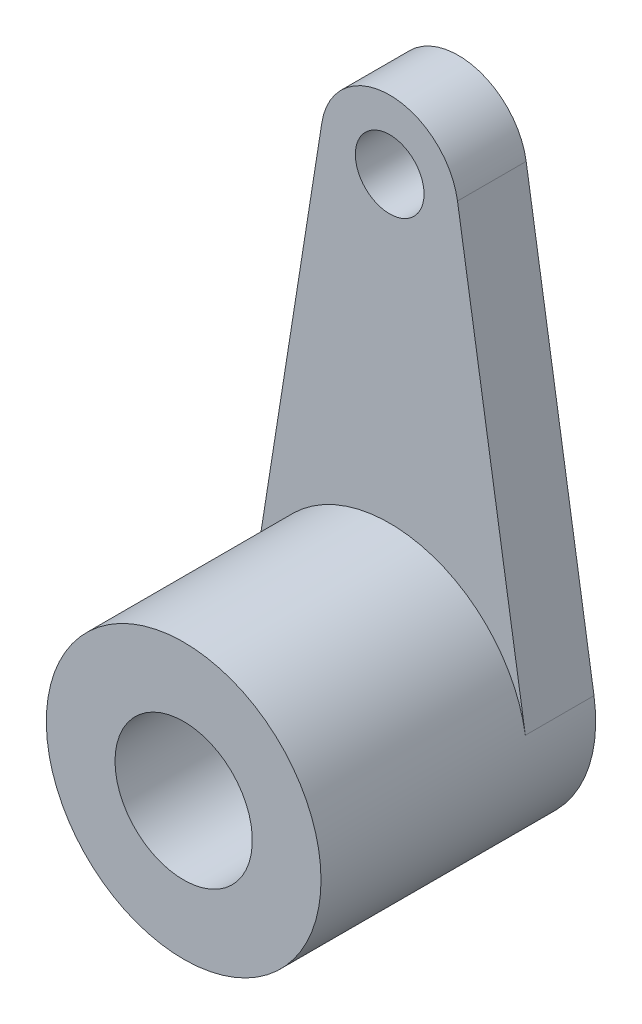
ISO-10303-21;
HEADER;
FILE_DESCRIPTION(('STEP AP214'),'2;1');
FILE_NAME('part.step','',(''),(''),'','','');
FILE_SCHEMA(('AUTOMOTIVE_DESIGN { 1 0 10303 214 1 1 1 1 }'));
ENDSEC;
DATA;
#1=APPLICATION_CONTEXT('core data for automotive mechanical design processes');
#2=APPLICATION_PROTOCOL_DEFINITION('international standard','automotive_design',2000,#1);
#3=PRODUCT_CONTEXT('',#1,'mechanical');
#4=PRODUCT('Part','Part','',(#3));
#5=PRODUCT_RELATED_PRODUCT_CATEGORY('part','',(#4));
#6=PRODUCT_DEFINITION_FORMATION('','',#4);
#7=PRODUCT_DEFINITION_CONTEXT('part definition',#1,'design');
#8=PRODUCT_DEFINITION('design','',#6,#7);
#9=PRODUCT_DEFINITION_SHAPE('','',#8);
#10=(LENGTH_UNIT() NAMED_UNIT(*) SI_UNIT(.MILLI.,.METRE.));
#11=(NAMED_UNIT(*) PLANE_ANGLE_UNIT() SI_UNIT($,.RADIAN.));
#12=(NAMED_UNIT(*) SI_UNIT($,.STERADIAN.) SOLID_ANGLE_UNIT());
#13=UNCERTAINTY_MEASURE_WITH_UNIT(LENGTH_MEASURE(1.E-05),#10,'distance_accuracy_value','');
#14=(GEOMETRIC_REPRESENTATION_CONTEXT(3) GLOBAL_UNCERTAINTY_ASSIGNED_CONTEXT((#13)) GLOBAL_UNIT_ASSIGNED_CONTEXT((#10,
#11,#12)) REPRESENTATION_CONTEXT('',''));
#15=CARTESIAN_POINT('',(0.,0.,0.));
#16=DIRECTION('',(0.,0.,1.));
#17=DIRECTION('',(1.,0.,0.));
#18=AXIS2_PLACEMENT_3D('',#15,#16,#17);
#19=CARTESIAN_POINT('',(14.6011978696653,-1.56419757761739,0.));
#20=DIRECTION('',(0.,0.,-1.));
#21=DIRECTION('',(1.,0.,0.));
#22=AXIS2_PLACEMENT_3D('',#19,#20,#21);
#23=PLANE('',#22);
#24=CARTESIAN_POINT('',(14.6011978696653,-1.56419757761739,0.));
#25=DIRECTION('',(0.,0.,1.));
#26=DIRECTION('',(1.,0.,0.));
#27=AXIS2_PLACEMENT_3D('',#24,#25,#26);
#28=CIRCLE('',#27,3.175);
#29=CARTESIAN_POINT('',(17.7761978696653,-1.56419757761739,0.));
#30=VERTEX_POINT('',#29);
#31=EDGE_CURVE('E43',#30,#30,#28,.T.);
#32=ORIENTED_EDGE('',*,*,#31,.T.);
#33=EDGE_LOOP('',(#32));
#34=FACE_BOUND('',#33,.T.);
#35=CARTESIAN_POINT('',(14.6011978696653,-1.56419757761739,0.));
#36=DIRECTION('',(0.,0.,1.));
#37=DIRECTION('',(1.,0.,0.));
#38=AXIS2_PLACEMENT_3D('',#35,#36,#37);
#39=CIRCLE('',#38,1.58749999999999);
#40=CARTESIAN_POINT('',(13.0136978696653,-1.56419757761739,0.));
#41=VERTEX_POINT('',#40);
#42=EDGE_CURVE('E111',#41,#41,#39,.T.);
#43=ORIENTED_EDGE('',*,*,#42,.F.);
#44=EDGE_LOOP('',(#43));
#45=FACE_BOUND('',#44,.T.);
#46=ADVANCED_FACE('F34',(#34,#45),#23,.F.);
#47=CARTESIAN_POINT('',(14.6011978696653,-1.56419757761739,-4.7625));
#48=DIRECTION('',(0.,0.,1.));
#49=DIRECTION('',(-1.,0.,0.));
#50=AXIS2_PLACEMENT_3D('',#47,#48,#49);
#51=CYLINDRICAL_SURFACE('',#50,3.175);
#52=CARTESIAN_POINT('',(14.6011978696653,-1.56419757761739,-4.7625));
#53=DIRECTION('',(0.,0.,1.));
#54=DIRECTION('',(1.,0.,0.));
#55=AXIS2_PLACEMENT_3D('',#52,#53,#54);
#56=CIRCLE('',#55,3.175);
#57=CARTESIAN_POINT('',(17.7372010765963,-1.06810395125359,-4.7625));
#58=VERTEX_POINT('',#57);
#59=CARTESIAN_POINT('',(11.4651947018512,-1.0681037039812,-4.7625));
#60=VERTEX_POINT('',#59);
#61=EDGE_CURVE('E11',#58,#60,#56,.T.);
#62=ORIENTED_EDGE('',*,*,#61,.T.);
#63=DIRECTION('',(0.,0.,1.));
#64=VECTOR('',#63,1.);
#65=CARTESIAN_POINT('',(11.4651947018512,-1.06810370398119,-6.35));
#66=LINE('',#65,#64);
#67=CARTESIAN_POINT('',(11.4651947018512,-1.06810370398119,-6.35));
#68=VERTEX_POINT('',#67);
#69=EDGE_CURVE('E101',#68,#60,#66,.T.);
#70=ORIENTED_EDGE('',*,*,#69,.F.);
#71=CARTESIAN_POINT('',(14.6011978696653,-1.56419757761739,-6.35));
#72=DIRECTION('',(0.,0.,1.));
#73=DIRECTION('',(1.,0.,0.));
#74=AXIS2_PLACEMENT_3D('',#71,#72,#73);
#75=CIRCLE('',#74,3.17499999999999);
#76=CARTESIAN_POINT('',(17.7372010765963,-1.06810395125359,-6.35));
#77=VERTEX_POINT('',#76);
#78=EDGE_CURVE('E96',#68,#77,#75,.T.);
#79=ORIENTED_EDGE('',*,*,#78,.T.);
#80=DIRECTION('',(0.,0.,1.));
#81=VECTOR('',#80,1.);
#82=CARTESIAN_POINT('',(17.7372010765963,-1.06810395125359,-6.35));
#83=LINE('',#82,#81);
#84=EDGE_CURVE('E91',#77,#58,#83,.T.);
#85=ORIENTED_EDGE('',*,*,#84,.T.);
#86=EDGE_LOOP('',(#62,#70,#79,#85));
#87=FACE_BOUND('',#86,.T.);
#88=ORIENTED_EDGE('',*,*,#31,.F.);
#89=EDGE_LOOP('',(#88));
#90=FACE_BOUND('',#89,.T.);
#91=ADVANCED_FACE('F36',(#87,#90),#51,.T.);
#92=CARTESIAN_POINT('',(14.6011978696653,-1.56419757761739,-4.7625));
#93=DIRECTION('',(0.,0.,1.));
#94=DIRECTION('',(-1.,0.,0.));
#95=AXIS2_PLACEMENT_3D('',#92,#93,#94);
#96=CYLINDRICAL_SURFACE('',#95,1.58749999999999);
#97=CARTESIAN_POINT('',(14.6011978696653,-1.56419757761739,-4.7625));
#98=DIRECTION('',(0.,0.,1.));
#99=DIRECTION('',(1.,0.,0.));
#100=AXIS2_PLACEMENT_3D('',#97,#98,#99);
#101=CIRCLE('',#100,1.58749999999999);
#102=CARTESIAN_POINT('',(13.0136978696653,-1.56419757761739,-4.7625));
#103=VERTEX_POINT('',#102);
#104=EDGE_CURVE('E108',#103,#103,#101,.T.);
#105=CARTESIAN_POINT('',(13.0136978696653,-1.56419757761739,-4.7625));
#106=CARTESIAN_POINT('',(13.0136978696653,-1.56419757761739,-4.712890625));
#107=CARTESIAN_POINT('',(13.0136978696653,-1.56419757761739,-4.66328125));
#108=CARTESIAN_POINT('',(13.0136978696653,-1.56419757761739,-4.5640625));
#109=CARTESIAN_POINT('',(13.0136978696653,-1.56419757761739,-4.514453125));
#110=CARTESIAN_POINT('',(13.0136978696653,-1.56419757761739,-4.415234375));
#111=CARTESIAN_POINT('',(13.0136978696653,-1.56419757761739,-4.365625));
#112=CARTESIAN_POINT('',(13.0136978696653,-1.56419757761739,-4.26640625));
#113=CARTESIAN_POINT('',(13.0136978696653,-1.56419757761739,-4.216796875));
#114=CARTESIAN_POINT('',(13.0136978696653,-1.56419757761739,-4.117578125));
#115=CARTESIAN_POINT('',(13.0136978696653,-1.56419757761739,-4.06796875));
#116=CARTESIAN_POINT('',(13.0136978696653,-1.56419757761739,-3.96875));
#117=CARTESIAN_POINT('',(13.0136978696653,-1.56419757761739,-3.919140625));
#118=CARTESIAN_POINT('',(13.0136978696653,-1.56419757761739,-3.819921875));
#119=CARTESIAN_POINT('',(13.0136978696653,-1.56419757761739,-3.7703125));
#120=CARTESIAN_POINT('',(13.0136978696653,-1.56419757761739,-3.67109375));
#121=CARTESIAN_POINT('',(13.0136978696653,-1.56419757761739,-3.621484375));
#122=CARTESIAN_POINT('',(13.0136978696653,-1.56419757761739,-3.522265625));
#123=CARTESIAN_POINT('',(13.0136978696653,-1.56419757761739,-3.47265625));
#124=CARTESIAN_POINT('',(13.0136978696653,-1.56419757761739,-3.3734375));
#125=CARTESIAN_POINT('',(13.0136978696653,-1.56419757761739,-3.323828125));
#126=CARTESIAN_POINT('',(13.0136978696653,-1.56419757761739,-3.224609375));
#127=CARTESIAN_POINT('',(13.0136978696653,-1.56419757761739,-3.175));
#128=CARTESIAN_POINT('',(13.0136978696653,-1.56419757761739,-3.07578125));
#129=CARTESIAN_POINT('',(13.0136978696653,-1.56419757761739,-3.026171875));
#130=CARTESIAN_POINT('',(13.0136978696653,-1.56419757761739,-2.926953125));
#131=CARTESIAN_POINT('',(13.0136978696653,-1.56419757761739,-2.87734375));
#132=CARTESIAN_POINT('',(13.0136978696653,-1.56419757761739,-2.778125));
#133=CARTESIAN_POINT('',(13.0136978696653,-1.56419757761739,-2.728515625));
#134=CARTESIAN_POINT('',(13.0136978696653,-1.56419757761739,-2.629296875));
#135=CARTESIAN_POINT('',(13.0136978696653,-1.56419757761739,-2.5796875));
#136=CARTESIAN_POINT('',(13.0136978696653,-1.56419757761739,-2.48046875));
#137=CARTESIAN_POINT('',(13.0136978696653,-1.56419757761739,-2.430859375));
#138=CARTESIAN_POINT('',(13.0136978696653,-1.56419757761739,-2.331640625));
#139=CARTESIAN_POINT('',(13.0136978696653,-1.56419757761739,-2.28203125));
#140=CARTESIAN_POINT('',(13.0136978696653,-1.56419757761739,-2.1828125));
#141=CARTESIAN_POINT('',(13.0136978696653,-1.56419757761739,-2.133203125));
#142=CARTESIAN_POINT('',(13.0136978696653,-1.56419757761739,-2.033984375));
#143=CARTESIAN_POINT('',(13.0136978696653,-1.56419757761739,-1.984375));
#144=CARTESIAN_POINT('',(13.0136978696653,-1.56419757761739,-1.88515625));
#145=CARTESIAN_POINT('',(13.0136978696653,-1.56419757761739,-1.835546875));
#146=CARTESIAN_POINT('',(13.0136978696653,-1.56419757761739,-1.736328125));
#147=CARTESIAN_POINT('',(13.0136978696653,-1.56419757761739,-1.68671875));
#148=CARTESIAN_POINT('',(13.0136978696653,-1.56419757761739,-1.5875));
#149=CARTESIAN_POINT('',(13.0136978696653,-1.56419757761739,-1.537890625));
#150=CARTESIAN_POINT('',(13.0136978696653,-1.56419757761739,-1.438671875));
#151=CARTESIAN_POINT('',(13.0136978696653,-1.56419757761739,-1.3890625));
#152=CARTESIAN_POINT('',(13.0136978696653,-1.56419757761739,-1.28984375));
#153=CARTESIAN_POINT('',(13.0136978696653,-1.56419757761739,-1.240234375));
#154=CARTESIAN_POINT('',(13.0136978696653,-1.56419757761739,-1.141015625));
#155=CARTESIAN_POINT('',(13.0136978696653,-1.56419757761739,-1.09140625));
#156=CARTESIAN_POINT('',(13.0136978696653,-1.56419757761739,-0.9921875));
#157=CARTESIAN_POINT('',(13.0136978696653,-1.56419757761739,-0.942578125));
#158=CARTESIAN_POINT('',(13.0136978696653,-1.56419757761739,-0.843359375));
#159=CARTESIAN_POINT('',(13.0136978696653,-1.56419757761739,-0.79375));
#160=CARTESIAN_POINT('',(13.0136978696653,-1.56419757761739,-0.69453125));
#161=CARTESIAN_POINT('',(13.0136978696653,-1.56419757761739,-0.644921875));
#162=CARTESIAN_POINT('',(13.0136978696653,-1.56419757761739,-0.545703125));
#163=CARTESIAN_POINT('',(13.0136978696653,-1.56419757761739,-0.49609375));
#164=CARTESIAN_POINT('',(13.0136978696653,-1.56419757761739,-0.396875));
#165=CARTESIAN_POINT('',(13.0136978696653,-1.56419757761739,-0.347265625));
#166=CARTESIAN_POINT('',(13.0136978696653,-1.56419757761739,-0.248046875));
#167=CARTESIAN_POINT('',(13.0136978696653,-1.56419757761739,-0.1984375));
#168=CARTESIAN_POINT('',(13.0136978696653,-1.56419757761739,-0.09921875));
#169=CARTESIAN_POINT('',(13.0136978696653,-1.56419757761739,-0.049609375));
#170=CARTESIAN_POINT('',(13.0136978696653,-1.56419757761739,0.));
#171=B_SPLINE_CURVE_WITH_KNOTS('',3,(#105,#106,#107,#108,#109,#110,#111,#112,#113,#114,#115,
#116,#117,#118,#119,#120,#121,#122,#123,#124,#125,#126,#127,#128,#129,#130,#131,#132,#133,#134,
#135,#136,#137,#138,#139,#140,#141,#142,#143,#144,#145,#146,#147,#148,#149,#150,#151,#152,#153,
#154,#155,#156,#157,#158,#159,#160,#161,#162,#163,#164,#165,#166,#167,#168,#169,#170),
.UNSPECIFIED.,.F.,.F.,(4,2,2,2,2,2,2,2,2,2,2,2,2,2,2,2,2,2,2,2,2,2,2,2,2,2,2,2,2,2,2,2,4),(0.,
0.148828124999999,0.297656249999999,0.446484374999999,0.595312499999999,0.744140625,0.89296875,
1.041796875,1.190625,1.339453125,1.48828125,1.637109375,1.7859375,1.934765625,2.08359375,
2.232421875,2.38125,2.530078125,2.67890625,2.827734375,2.9765625,3.125390625,3.27421875,
3.423046875,3.571875,3.720703125,3.86953125,4.018359375,4.1671875,4.316015625,4.46484375,
4.613671875,4.7625),.UNSPECIFIED.);
#172=EDGE_CURVE('BSEAM141',#103,#41,#171,.T.);
#173=ORIENTED_EDGE('',*,*,#104,.F.);
#174=ORIENTED_EDGE('',*,*,#42,.T.);
#175=ORIENTED_EDGE('',*,*,#172,.T.);
#176=ORIENTED_EDGE('',*,*,#172,.F.);
#177=EDGE_LOOP('',(#173,#175,#174,#176));
#178=FACE_BOUND('',#177,.T.);
#179=ADVANCED_FACE('F141',(#178),#96,.F.);
#180=CARTESIAN_POINT('',(14.6011978696653,-1.56419757761739,-4.7625));
#181=DIRECTION('',(0.,0.,-1.));
#182=DIRECTION('',(1.,0.,0.));
#183=AXIS2_PLACEMENT_3D('',#180,#181,#182);
#184=PLANE('',#183);
#185=ORIENTED_EDGE('',*,*,#104,.T.);
#186=EDGE_LOOP('',(#185));
#187=FACE_BOUND('',#186,.T.);
#188=ADVANCED_FACE('F133',(#187),#184,.F.);
#189=CARTESIAN_POINT('',(14.601198270221,8.59580242238259,-4.7625));
#190=DIRECTION('',(0.,0.,1.));
#191=DIRECTION('',(1.,0.,0.));
#192=AXIS2_PLACEMENT_3D('',#189,#190,#191);
#193=CIRCLE('',#192,0.793749999999999);
#194=CARTESIAN_POINT('',(15.394948270221,8.59580242238259,-4.7625));
#195=VERTEX_POINT('',#194);
#196=EDGE_CURVE('E171',#195,#195,#193,.T.);
#197=ORIENTED_EDGE('',*,*,#196,.F.);
#198=EDGE_LOOP('',(#197));
#199=FACE_BOUND('',#198,.T.);
#200=DIRECTION('',(-0.156249961059464,0.987717545490064,0.));
#201=VECTOR('',#200,1.);
#202=CARTESIAN_POINT('',(17.7372010765963,-1.06810395125359,-4.7625));
#203=LINE('',#202,#201);
#204=CARTESIAN_POINT('',(16.169199872905,8.8438492405043,-4.7625));
#205=VERTEX_POINT('',#204);
#206=EDGE_CURVE('E106',#58,#205,#203,.T.);
#207=ORIENTED_EDGE('',*,*,#206,.T.);
#208=CARTESIAN_POINT('',(14.601198270221,8.59580242238259,-4.7625));
#209=DIRECTION('',(0.,0.,1.));
#210=DIRECTION('',(1.,0.,0.));
#211=AXIS2_PLACEMENT_3D('',#208,#209,#210);
#212=CIRCLE('',#211,1.5875);
#213=CARTESIAN_POINT('',(13.0331966863139,8.84384935920068,-4.7625));
#214=VERTEX_POINT('',#213);
#215=EDGE_CURVE('E88',#205,#214,#212,.T.);
#216=ORIENTED_EDGE('',*,*,#215,.T.);
#217=DIRECTION('',(-0.156250038940534,-0.987717533169824,0.));
#218=VECTOR('',#217,1.);
#219=CARTESIAN_POINT('',(11.4651947018512,-1.06810370398119,-4.7625));
#220=LINE('',#219,#218);
#221=EDGE_CURVE('E51',#214,#60,#220,.T.);
#222=ORIENTED_EDGE('',*,*,#221,.T.);
#223=ORIENTED_EDGE('',*,*,#61,.F.);
#224=EDGE_LOOP('',(#207,#216,#222,#223));
#225=FACE_BOUND('',#224,.T.);
#226=ADVANCED_FACE('F131',(#199,#225),#184,.F.);
#227=CARTESIAN_POINT('',(14.6011978696653,-1.56419757761739,-6.35));
#228=DIRECTION('',(0.,0.,-1.));
#229=DIRECTION('',(1.,0.,0.));
#230=AXIS2_PLACEMENT_3D('',#227,#228,#229);
#231=PLANE('',#230);
#232=ORIENTED_EDGE('',*,*,#78,.F.);
#233=DIRECTION('',(-0.156250038940534,-0.987717533169824,0.));
#234=VECTOR('',#233,1.);
#235=CARTESIAN_POINT('',(11.4651947018512,-1.06810370398119,-6.35));
#236=LINE('',#235,#234);
#237=CARTESIAN_POINT('',(13.0331966863139,8.84384935920068,-6.35));
#238=VERTEX_POINT('',#237);
#239=EDGE_CURVE('E59',#238,#68,#236,.T.);
#240=ORIENTED_EDGE('',*,*,#239,.F.);
#241=CARTESIAN_POINT('',(14.601198270221,8.59580242238259,-6.35));
#242=DIRECTION('',(0.,0.,1.));
#243=DIRECTION('',(1.,0.,0.));
#244=AXIS2_PLACEMENT_3D('',#241,#242,#243);
#245=CIRCLE('',#244,1.5875);
#246=CARTESIAN_POINT('',(16.169199872905,8.8438492405043,-6.35));
#247=VERTEX_POINT('',#246);
#248=EDGE_CURVE('E87',#247,#238,#245,.T.);
#249=ORIENTED_EDGE('',*,*,#248,.F.);
#250=DIRECTION('',(-0.156249961059464,0.987717545490064,0.));
#251=VECTOR('',#250,1.);
#252=CARTESIAN_POINT('',(17.7372010765963,-1.06810395125359,-6.35));
#253=LINE('',#252,#251);
#254=EDGE_CURVE('E82',#77,#247,#253,.T.);
#255=ORIENTED_EDGE('',*,*,#254,.F.);
#256=EDGE_LOOP('',(#232,#240,#249,#255));
#257=FACE_BOUND('',#256,.T.);
#258=CARTESIAN_POINT('',(14.601198270221,8.59580242238259,-6.35));
#259=DIRECTION('',(0.,0.,1.));
#260=DIRECTION('',(1.,0.,0.));
#261=AXIS2_PLACEMENT_3D('',#258,#259,#260);
#262=CIRCLE('',#261,0.793749999999999);
#263=CARTESIAN_POINT('',(15.394948270221,8.59580242238259,-6.35));
#264=VERTEX_POINT('',#263);
#265=EDGE_CURVE('E119',#264,#264,#262,.T.);
#266=ORIENTED_EDGE('',*,*,#265,.T.);
#267=EDGE_LOOP('',(#266));
#268=FACE_BOUND('',#267,.T.);
#269=ADVANCED_FACE('F98',(#257,#268),#231,.T.);
#270=CARTESIAN_POINT('',(17.7372010765963,-1.06810395125359,-6.35));
#271=DIRECTION('',(-0.987717545490064,-0.156249961059464,0.));
#272=DIRECTION('',(0.156249961059464,-0.987717545490064,0.));
#273=AXIS2_PLACEMENT_3D('',#270,#271,#272);
#274=PLANE('',#273);
#275=ORIENTED_EDGE('',*,*,#206,.F.);
#276=ORIENTED_EDGE('',*,*,#84,.F.);
#277=ORIENTED_EDGE('',*,*,#254,.T.);
#278=DIRECTION('',(0.,0.,1.));
#279=VECTOR('',#278,1.);
#280=CARTESIAN_POINT('',(16.169199872905,8.8438492405043,-6.35));
#281=LINE('',#280,#279);
#282=EDGE_CURVE('E85',#247,#205,#281,.T.);
#283=ORIENTED_EDGE('',*,*,#282,.T.);
#284=EDGE_LOOP('',(#275,#276,#277,#283));
#285=FACE_BOUND('',#284,.T.);
#286=ADVANCED_FACE('F93',(#285),#274,.F.);
#287=CARTESIAN_POINT('',(14.601198270221,8.59580242238259,-6.35));
#288=DIRECTION('',(0.,0.,1.));
#289=DIRECTION('',(-1.,0.,0.));
#290=AXIS2_PLACEMENT_3D('',#287,#288,#289);
#291=CYLINDRICAL_SURFACE('',#290,1.5875);
#292=ORIENTED_EDGE('',*,*,#215,.F.);
#293=ORIENTED_EDGE('',*,*,#282,.F.);
#294=ORIENTED_EDGE('',*,*,#248,.T.);
#295=DIRECTION('',(0.,0.,1.));
#296=VECTOR('',#295,1.);
#297=CARTESIAN_POINT('',(13.0331966863139,8.84384935920068,-6.35));
#298=LINE('',#297,#296);
#299=EDGE_CURVE('E76',#238,#214,#298,.T.);
#300=ORIENTED_EDGE('',*,*,#299,.T.);
#301=EDGE_LOOP('',(#292,#293,#294,#300));
#302=FACE_BOUND('',#301,.T.);
#303=ADVANCED_FACE('F86',(#302),#291,.T.);
#304=CARTESIAN_POINT('',(11.4651947018512,-1.06810370398119,-6.35));
#305=DIRECTION('',(0.987717533169824,-0.156250038940534,0.));
#306=DIRECTION('',(0.156250038940534,0.987717533169824,0.));
#307=AXIS2_PLACEMENT_3D('',#304,#305,#306);
#308=PLANE('',#307);
#309=ORIENTED_EDGE('',*,*,#221,.F.);
#310=ORIENTED_EDGE('',*,*,#299,.F.);
#311=ORIENTED_EDGE('',*,*,#239,.T.);
#312=ORIENTED_EDGE('',*,*,#69,.T.);
#313=EDGE_LOOP('',(#309,#310,#311,#312));
#314=FACE_BOUND('',#313,.T.);
#315=ADVANCED_FACE('F128',(#314),#308,.F.);
#316=CARTESIAN_POINT('',(14.601198270221,8.59580242238259,-6.35));
#317=DIRECTION('',(0.,0.,1.));
#318=DIRECTION('',(-1.,0.,0.));
#319=AXIS2_PLACEMENT_3D('',#316,#317,#318);
#320=CYLINDRICAL_SURFACE('',#319,0.793749999999999);
#321=ORIENTED_EDGE('',*,*,#265,.F.);
#322=EDGE_LOOP('',(#321));
#323=FACE_BOUND('',#322,.T.);
#324=ORIENTED_EDGE('',*,*,#196,.T.);
#325=EDGE_LOOP('',(#324));
#326=FACE_BOUND('',#325,.T.);
#327=ADVANCED_FACE('F159',(#323,#326),#320,.F.);
#328=CLOSED_SHELL('',(#46,#91,#179,#188,#226,#269,#286,#303,#315,#327));
#329=MANIFOLD_SOLID_BREP('B2',#328);
#330=ADVANCED_BREP_SHAPE_REPRESENTATION('',(#18,#329),#14);
#331=SHAPE_DEFINITION_REPRESENTATION(#9,#330);
ENDSEC;
END-ISO-10303-21;
